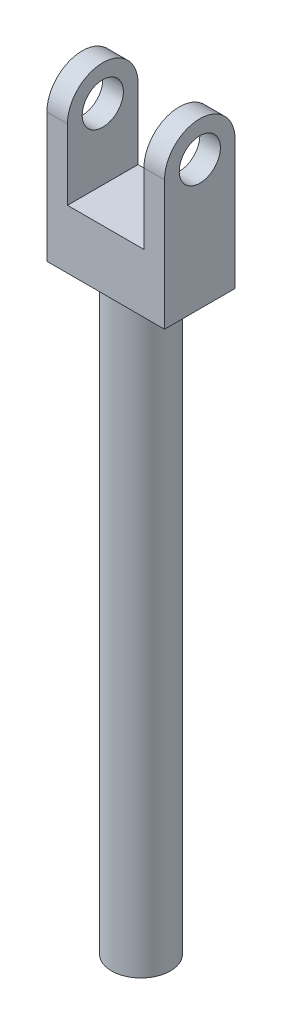
ISO-10303-21;
HEADER;
FILE_DESCRIPTION(('STEP AP214'),'2;1');
FILE_NAME('part.step','',(''),(''),'','','');
FILE_SCHEMA(('AUTOMOTIVE_DESIGN { 1 0 10303 214 1 1 1 1 }'));
ENDSEC;
DATA;
#1=APPLICATION_CONTEXT('core data for automotive mechanical design processes');
#2=APPLICATION_PROTOCOL_DEFINITION('international standard','automotive_design',2000,#1);
#3=PRODUCT_CONTEXT('',#1,'mechanical');
#4=PRODUCT('Part','Part','',(#3));
#5=PRODUCT_RELATED_PRODUCT_CATEGORY('part','',(#4));
#6=PRODUCT_DEFINITION_FORMATION('','',#4);
#7=PRODUCT_DEFINITION_CONTEXT('part definition',#1,'design');
#8=PRODUCT_DEFINITION('design','',#6,#7);
#9=PRODUCT_DEFINITION_SHAPE('','',#8);
#10=(LENGTH_UNIT() NAMED_UNIT(*) SI_UNIT(.MILLI.,.METRE.));
#11=(NAMED_UNIT(*) PLANE_ANGLE_UNIT() SI_UNIT($,.RADIAN.));
#12=(NAMED_UNIT(*) SI_UNIT($,.STERADIAN.) SOLID_ANGLE_UNIT());
#13=UNCERTAINTY_MEASURE_WITH_UNIT(LENGTH_MEASURE(1.E-05),#10,'distance_accuracy_value','');
#14=(GEOMETRIC_REPRESENTATION_CONTEXT(3) GLOBAL_UNCERTAINTY_ASSIGNED_CONTEXT((#13)) GLOBAL_UNIT_ASSIGNED_CONTEXT((#10,
#11,#12)) REPRESENTATION_CONTEXT('',''));
#15=CARTESIAN_POINT('',(0.,0.,0.));
#16=DIRECTION('',(0.,0.,1.));
#17=DIRECTION('',(1.,0.,0.));
#18=AXIS2_PLACEMENT_3D('',#15,#16,#17);
#19=CARTESIAN_POINT('',(10.,-22.,6.));
#20=DIRECTION('',(0.,1.,0.));
#21=DIRECTION('',(0.,0.,1.));
#22=AXIS2_PLACEMENT_3D('',#19,#20,#21);
#23=PLANE('',#22);
#24=DIRECTION('',(0.,0.,-1.));
#25=VECTOR('',#24,1.);
#26=CARTESIAN_POINT('',(-10.,-22.,6.));
#27=LINE('',#26,#25);
#28=CARTESIAN_POINT('',(-10.,-22.,6.));
#29=VERTEX_POINT('',#28);
#30=CARTESIAN_POINT('',(-10.,-22.,-6.));
#31=VERTEX_POINT('',#30);
#32=EDGE_CURVE('E158',#29,#31,#27,.T.);
#33=ORIENTED_EDGE('',*,*,#32,.T.);
#34=DIRECTION('',(-1.,0.,0.));
#35=VECTOR('',#34,1.);
#36=CARTESIAN_POINT('',(10.,-22.,-6.));
#37=LINE('',#36,#35);
#38=CARTESIAN_POINT('',(10.,-22.,-6.));
#39=VERTEX_POINT('',#38);
#40=EDGE_CURVE('E164',#39,#31,#37,.T.);
#41=ORIENTED_EDGE('',*,*,#40,.F.);
#42=DIRECTION('',(0.,0.,-1.));
#43=VECTOR('',#42,1.);
#44=CARTESIAN_POINT('',(10.,-22.,6.));
#45=LINE('',#44,#43);
#46=CARTESIAN_POINT('',(10.,-22.,6.));
#47=VERTEX_POINT('',#46);
#48=EDGE_CURVE('E152',#47,#39,#45,.T.);
#49=ORIENTED_EDGE('',*,*,#48,.F.);
#50=DIRECTION('',(-1.,0.,0.));
#51=VECTOR('',#50,1.);
#52=CARTESIAN_POINT('',(10.,-22.,6.));
#53=LINE('',#52,#51);
#54=EDGE_CURVE('E167',#47,#29,#53,.T.);
#55=ORIENTED_EDGE('',*,*,#54,.T.);
#56=EDGE_LOOP('',(#33,#41,#49,#55));
#57=FACE_BOUND('',#56,.T.);
#58=CARTESIAN_POINT('',(0.,-22.,0.));
#59=DIRECTION('',(0.,1.,0.));
#60=DIRECTION('',(0.,0.,1.));
#61=AXIS2_PLACEMENT_3D('',#58,#59,#60);
#62=CIRCLE('',#61,5.);
#63=CARTESIAN_POINT('',(0.,-22.,5.));
#64=VERTEX_POINT('',#63);
#65=EDGE_CURVE('E11',#64,#64,#62,.F.);
#66=ORIENTED_EDGE('',*,*,#65,.F.);
#67=EDGE_LOOP('',(#66));
#68=FACE_BOUND('',#67,.T.);
#69=ADVANCED_FACE('F33',(#57,#68),#23,.F.);
#70=CARTESIAN_POINT('',(10.,0.,0.));
#71=DIRECTION('',(-1.,0.,0.));
#72=DIRECTION('',(0.,0.,1.));
#73=AXIS2_PLACEMENT_3D('',#70,#71,#72);
#74=CYLINDRICAL_SURFACE('',#73,6.);
#75=CARTESIAN_POINT('',(-6.5,0.,0.));
#76=DIRECTION('',(-1.,0.,0.));
#77=DIRECTION('',(0.,-1.,0.));
#78=AXIS2_PLACEMENT_3D('',#75,#76,#77);
#79=CIRCLE('',#78,6.);
#80=CARTESIAN_POINT('',(-6.5,0.,6.));
#81=VERTEX_POINT('',#80);
#82=CARTESIAN_POINT('',(-6.5,0.,-6.));
#83=VERTEX_POINT('',#82);
#84=EDGE_CURVE('E139',#81,#83,#79,.T.);
#85=ORIENTED_EDGE('',*,*,#84,.T.);
#86=DIRECTION('',(-1.,0.,0.));
#87=VECTOR('',#86,1.);
#88=CARTESIAN_POINT('',(10.,0.,-6.));
#89=LINE('',#88,#87);
#90=CARTESIAN_POINT('',(-10.,0.,-6.));
#91=VERTEX_POINT('',#90);
#92=EDGE_CURVE('E79',#83,#91,#89,.T.);
#93=ORIENTED_EDGE('',*,*,#92,.T.);
#94=CARTESIAN_POINT('',(-10.,0.,0.));
#95=DIRECTION('',(1.,0.,0.));
#96=DIRECTION('',(0.,0.,-1.));
#97=AXIS2_PLACEMENT_3D('',#94,#95,#96);
#98=CIRCLE('',#97,6.);
#99=CARTESIAN_POINT('',(-10.,0.,6.));
#100=VERTEX_POINT('',#99);
#101=EDGE_CURVE('E145',#91,#100,#98,.T.);
#102=ORIENTED_EDGE('',*,*,#101,.T.);
#103=DIRECTION('',(-1.,0.,0.));
#104=VECTOR('',#103,1.);
#105=CARTESIAN_POINT('',(10.,0.,6.));
#106=LINE('',#105,#104);
#107=EDGE_CURVE('E170',#81,#100,#106,.T.);
#108=ORIENTED_EDGE('',*,*,#107,.F.);
#109=EDGE_LOOP('',(#85,#93,#102,#108));
#110=FACE_BOUND('',#109,.T.);
#111=ADVANCED_FACE('F193',(#110),#74,.T.);
#112=CARTESIAN_POINT('',(10.,0.,0.));
#113=DIRECTION('',(-1.,0.,0.));
#114=DIRECTION('',(0.,0.,1.));
#115=AXIS2_PLACEMENT_3D('',#112,#113,#114);
#116=CYLINDRICAL_SURFACE('',#115,3.5);
#117=CARTESIAN_POINT('',(-6.5,0.,0.));
#118=DIRECTION('',(-1.,0.,0.));
#119=DIRECTION('',(0.,-1.,0.));
#120=AXIS2_PLACEMENT_3D('',#117,#118,#119);
#121=CIRCLE('',#120,3.5);
#122=CARTESIAN_POINT('',(-6.5,-3.5,0.));
#123=VERTEX_POINT('',#122);
#124=EDGE_CURVE('E128',#123,#123,#121,.T.);
#125=ORIENTED_EDGE('',*,*,#124,.F.);
#126=EDGE_LOOP('',(#125));
#127=FACE_BOUND('',#126,.T.);
#128=CARTESIAN_POINT('',(-10.,0.,0.));
#129=DIRECTION('',(1.,0.,0.));
#130=DIRECTION('',(0.,0.,-1.));
#131=AXIS2_PLACEMENT_3D('',#128,#129,#130);
#132=CIRCLE('',#131,3.5);
#133=CARTESIAN_POINT('',(-10.,0.,-3.5));
#134=VERTEX_POINT('',#133);
#135=EDGE_CURVE('E113',#134,#134,#132,.T.);
#136=ORIENTED_EDGE('',*,*,#135,.F.);
#137=EDGE_LOOP('',(#136));
#138=FACE_BOUND('',#137,.T.);
#139=ADVANCED_FACE('F199',(#127,#138),#116,.F.);
#140=CARTESIAN_POINT('',(10.,0.,0.));
#141=DIRECTION('',(1.,0.,0.));
#142=DIRECTION('',(0.,0.,-1.));
#143=AXIS2_PLACEMENT_3D('',#140,#141,#142);
#144=PLANE('',#143);
#145=CARTESIAN_POINT('',(10.,0.,0.));
#146=DIRECTION('',(1.,0.,0.));
#147=DIRECTION('',(0.,0.,-1.));
#148=AXIS2_PLACEMENT_3D('',#145,#146,#147);
#149=CIRCLE('',#148,6.);
#150=CARTESIAN_POINT('',(10.,0.,-6.));
#151=VERTEX_POINT('',#150);
#152=CARTESIAN_POINT('',(10.,0.,6.));
#153=VERTEX_POINT('',#152);
#154=EDGE_CURVE('E148',#151,#153,#149,.T.);
#155=ORIENTED_EDGE('',*,*,#154,.T.);
#156=DIRECTION('',(0.,-1.,0.));
#157=VECTOR('',#156,1.);
#158=CARTESIAN_POINT('',(10.,0.,6.));
#159=LINE('',#158,#157);
#160=EDGE_CURVE('E87',#153,#47,#159,.T.);
#161=ORIENTED_EDGE('',*,*,#160,.T.);
#162=ORIENTED_EDGE('',*,*,#48,.T.);
#163=DIRECTION('',(0.,1.,0.));
#164=VECTOR('',#163,1.);
#165=CARTESIAN_POINT('',(10.,0.,-6.));
#166=LINE('',#165,#164);
#167=EDGE_CURVE('E57',#39,#151,#166,.T.);
#168=ORIENTED_EDGE('',*,*,#167,.T.);
#169=EDGE_LOOP('',(#155,#161,#162,#168));
#170=FACE_BOUND('',#169,.T.);
#171=CARTESIAN_POINT('',(10.,0.,0.));
#172=DIRECTION('',(1.,0.,0.));
#173=DIRECTION('',(0.,0.,-1.));
#174=AXIS2_PLACEMENT_3D('',#171,#172,#173);
#175=CIRCLE('',#174,3.5);
#176=CARTESIAN_POINT('',(10.,0.,-3.5));
#177=VERTEX_POINT('',#176);
#178=EDGE_CURVE('E142',#177,#177,#175,.T.);
#179=ORIENTED_EDGE('',*,*,#178,.F.);
#180=EDGE_LOOP('',(#179));
#181=FACE_BOUND('',#180,.T.);
#182=ADVANCED_FACE('F213',(#170,#181),#144,.T.);
#183=CARTESIAN_POINT('',(-10.,0.,0.));
#184=DIRECTION('',(1.,0.,0.));
#185=DIRECTION('',(0.,0.,-1.));
#186=AXIS2_PLACEMENT_3D('',#183,#184,#185);
#187=PLANE('',#186);
#188=ORIENTED_EDGE('',*,*,#101,.F.);
#189=DIRECTION('',(0.,1.,0.));
#190=VECTOR('',#189,1.);
#191=CARTESIAN_POINT('',(-10.,0.,-6.));
#192=LINE('',#191,#190);
#193=EDGE_CURVE('E150',#31,#91,#192,.T.);
#194=ORIENTED_EDGE('',*,*,#193,.F.);
#195=ORIENTED_EDGE('',*,*,#32,.F.);
#196=DIRECTION('',(0.,-1.,0.));
#197=VECTOR('',#196,1.);
#198=CARTESIAN_POINT('',(-10.,0.,6.));
#199=LINE('',#198,#197);
#200=EDGE_CURVE('E156',#100,#29,#199,.T.);
#201=ORIENTED_EDGE('',*,*,#200,.F.);
#202=EDGE_LOOP('',(#188,#194,#195,#201));
#203=FACE_BOUND('',#202,.T.);
#204=ORIENTED_EDGE('',*,*,#135,.T.);
#205=EDGE_LOOP('',(#204));
#206=FACE_BOUND('',#205,.T.);
#207=ADVANCED_FACE('F208',(#203,#206),#187,.F.);
#208=CARTESIAN_POINT('',(6.5,0.,-6.));
#209=VERTEX_POINT('',#208);
#210=EDGE_CURVE('E161',#151,#209,#89,.T.);
#211=ORIENTED_EDGE('',*,*,#210,.T.);
#212=CARTESIAN_POINT('',(6.5,0.,0.));
#213=DIRECTION('',(1.,0.,0.));
#214=DIRECTION('',(0.,1.,0.));
#215=AXIS2_PLACEMENT_3D('',#212,#213,#214);
#216=CIRCLE('',#215,6.);
#217=CARTESIAN_POINT('',(6.5,0.,6.));
#218=VERTEX_POINT('',#217);
#219=EDGE_CURVE('E129',#209,#218,#216,.T.);
#220=ORIENTED_EDGE('',*,*,#219,.T.);
#221=EDGE_CURVE('E127',#153,#218,#106,.T.);
#222=ORIENTED_EDGE('',*,*,#221,.F.);
#223=ORIENTED_EDGE('',*,*,#154,.F.);
#224=EDGE_LOOP('',(#211,#220,#222,#223));
#225=FACE_BOUND('',#224,.T.);
#226=ADVANCED_FACE('F35',(#225),#74,.T.);
#227=CARTESIAN_POINT('',(10.,0.,6.));
#228=DIRECTION('',(0.,0.,-1.));
#229=DIRECTION('',(0.,1.,0.));
#230=AXIS2_PLACEMENT_3D('',#227,#228,#229);
#231=PLANE('',#230);
#232=DIRECTION('',(-1.,0.,0.));
#233=VECTOR('',#232,1.);
#234=CARTESIAN_POINT('',(10.,-12.,6.));
#235=LINE('',#234,#233);
#236=CARTESIAN_POINT('',(6.5,-12.,6.));
#237=VERTEX_POINT('',#236);
#238=CARTESIAN_POINT('',(-6.5,-12.,6.));
#239=VERTEX_POINT('',#238);
#240=EDGE_CURVE('E107',#237,#239,#235,.T.);
#241=ORIENTED_EDGE('',*,*,#240,.T.);
#242=DIRECTION('',(0.,1.,0.));
#243=VECTOR('',#242,1.);
#244=CARTESIAN_POINT('',(-6.5,0.,6.));
#245=LINE('',#244,#243);
#246=EDGE_CURVE('E114',#239,#81,#245,.T.);
#247=ORIENTED_EDGE('',*,*,#246,.T.);
#248=ORIENTED_EDGE('',*,*,#107,.T.);
#249=ORIENTED_EDGE('',*,*,#200,.T.);
#250=ORIENTED_EDGE('',*,*,#54,.F.);
#251=ORIENTED_EDGE('',*,*,#160,.F.);
#252=ORIENTED_EDGE('',*,*,#221,.T.);
#253=DIRECTION('',(0.,-1.,0.));
#254=VECTOR('',#253,1.);
#255=CARTESIAN_POINT('',(6.5,0.,6.));
#256=LINE('',#255,#254);
#257=EDGE_CURVE('E118',#218,#237,#256,.T.);
#258=ORIENTED_EDGE('',*,*,#257,.T.);
#259=EDGE_LOOP('',(#241,#247,#248,#249,#250,#251,#252,#258));
#260=FACE_BOUND('',#259,.T.);
#261=ADVANCED_FACE('F125',(#260),#231,.F.);
#262=CARTESIAN_POINT('',(10.,0.,-6.));
#263=DIRECTION('',(0.,0.,1.));
#264=DIRECTION('',(0.,-1.,0.));
#265=AXIS2_PLACEMENT_3D('',#262,#263,#264);
#266=PLANE('',#265);
#267=ORIENTED_EDGE('',*,*,#92,.F.);
#268=DIRECTION('',(0.,-1.,0.));
#269=VECTOR('',#268,1.);
#270=CARTESIAN_POINT('',(-6.5,0.,-6.));
#271=LINE('',#270,#269);
#272=CARTESIAN_POINT('',(-6.5,-12.,-6.));
#273=VERTEX_POINT('',#272);
#274=EDGE_CURVE('E132',#83,#273,#271,.T.);
#275=ORIENTED_EDGE('',*,*,#274,.T.);
#276=DIRECTION('',(1.,0.,0.));
#277=VECTOR('',#276,1.);
#278=CARTESIAN_POINT('',(10.,-12.,-6.));
#279=LINE('',#278,#277);
#280=CARTESIAN_POINT('',(6.5,-12.,-6.));
#281=VERTEX_POINT('',#280);
#282=EDGE_CURVE('E41',#273,#281,#279,.T.);
#283=ORIENTED_EDGE('',*,*,#282,.T.);
#284=DIRECTION('',(0.,1.,0.));
#285=VECTOR('',#284,1.);
#286=CARTESIAN_POINT('',(6.5,0.,-6.));
#287=LINE('',#286,#285);
#288=EDGE_CURVE('E121',#281,#209,#287,.T.);
#289=ORIENTED_EDGE('',*,*,#288,.T.);
#290=ORIENTED_EDGE('',*,*,#210,.F.);
#291=ORIENTED_EDGE('',*,*,#167,.F.);
#292=ORIENTED_EDGE('',*,*,#40,.T.);
#293=ORIENTED_EDGE('',*,*,#193,.T.);
#294=EDGE_LOOP('',(#267,#275,#283,#289,#290,#291,#292,#293));
#295=FACE_BOUND('',#294,.T.);
#296=ADVANCED_FACE('F174',(#295),#266,.F.);
#297=CARTESIAN_POINT('',(6.5,0.,0.));
#298=DIRECTION('',(1.,0.,0.));
#299=DIRECTION('',(0.,1.,0.));
#300=AXIS2_PLACEMENT_3D('',#297,#298,#299);
#301=CIRCLE('',#300,3.5);
#302=CARTESIAN_POINT('',(6.5,3.5,0.));
#303=VERTEX_POINT('',#302);
#304=EDGE_CURVE('E123',#303,#303,#301,.T.);
#305=ORIENTED_EDGE('',*,*,#304,.F.);
#306=EDGE_LOOP('',(#305));
#307=FACE_BOUND('',#306,.T.);
#308=ORIENTED_EDGE('',*,*,#178,.T.);
#309=EDGE_LOOP('',(#308));
#310=FACE_BOUND('',#309,.T.);
#311=ADVANCED_FACE('F207',(#307,#310),#116,.F.);
#312=CARTESIAN_POINT('',(-6.5,-12.,-10.));
#313=DIRECTION('',(0.,-1.,0.));
#314=DIRECTION('',(0.,0.,-1.));
#315=AXIS2_PLACEMENT_3D('',#312,#313,#314);
#316=PLANE('',#315);
#317=DIRECTION('',(0.,0.,1.));
#318=VECTOR('',#317,1.);
#319=CARTESIAN_POINT('',(6.5,-12.,-10.));
#320=LINE('',#319,#318);
#321=EDGE_CURVE('E48',#281,#237,#320,.T.);
#322=ORIENTED_EDGE('',*,*,#321,.F.);
#323=ORIENTED_EDGE('',*,*,#282,.F.);
#324=DIRECTION('',(0.,0.,1.));
#325=VECTOR('',#324,1.);
#326=CARTESIAN_POINT('',(-6.5,-12.,-10.));
#327=LINE('',#326,#325);
#328=EDGE_CURVE('E110',#273,#239,#327,.T.);
#329=ORIENTED_EDGE('',*,*,#328,.T.);
#330=ORIENTED_EDGE('',*,*,#240,.F.);
#331=EDGE_LOOP('',(#322,#323,#329,#330));
#332=FACE_BOUND('',#331,.T.);
#333=ADVANCED_FACE('F108',(#332),#316,.F.);
#334=CARTESIAN_POINT('',(-6.5,6.00000000000001,-10.));
#335=DIRECTION('',(-1.,0.,0.));
#336=DIRECTION('',(0.,-1.,0.));
#337=AXIS2_PLACEMENT_3D('',#334,#335,#336);
#338=PLANE('',#337);
#339=ORIENTED_EDGE('',*,*,#124,.T.);
#340=EDGE_LOOP('',(#339));
#341=FACE_BOUND('',#340,.T.);
#342=ORIENTED_EDGE('',*,*,#328,.F.);
#343=ORIENTED_EDGE('',*,*,#274,.F.);
#344=ORIENTED_EDGE('',*,*,#84,.F.);
#345=ORIENTED_EDGE('',*,*,#246,.F.);
#346=EDGE_LOOP('',(#342,#343,#344,#345));
#347=FACE_BOUND('',#346,.T.);
#348=ADVANCED_FACE('F177',(#341,#347),#338,.F.);
#349=CARTESIAN_POINT('',(6.5,6.00000000000001,-10.));
#350=DIRECTION('',(1.,0.,0.));
#351=DIRECTION('',(0.,1.,0.));
#352=AXIS2_PLACEMENT_3D('',#349,#350,#351);
#353=PLANE('',#352);
#354=ORIENTED_EDGE('',*,*,#304,.T.);
#355=EDGE_LOOP('',(#354));
#356=FACE_BOUND('',#355,.T.);
#357=ORIENTED_EDGE('',*,*,#219,.F.);
#358=ORIENTED_EDGE('',*,*,#288,.F.);
#359=ORIENTED_EDGE('',*,*,#321,.T.);
#360=ORIENTED_EDGE('',*,*,#257,.F.);
#361=EDGE_LOOP('',(#357,#358,#359,#360));
#362=FACE_BOUND('',#361,.T.);
#363=ADVANCED_FACE('F117',(#356,#362),#353,.F.);
#364=CARTESIAN_POINT('',(0.,-122.,0.));
#365=DIRECTION('',(0.,1.,0.));
#366=DIRECTION('',(0.,0.,1.));
#367=AXIS2_PLACEMENT_3D('',#364,#365,#366);
#368=CYLINDRICAL_SURFACE('',#367,5.);
#369=CARTESIAN_POINT('',(0.,-122.,0.));
#370=DIRECTION('',(0.,-1.,0.));
#371=DIRECTION('',(0.,0.,-1.));
#372=AXIS2_PLACEMENT_3D('',#369,#370,#371);
#373=CIRCLE('',#372,5.);
#374=CARTESIAN_POINT('',(0.,-122.,-5.));
#375=VERTEX_POINT('',#374);
#376=EDGE_CURVE('E178',#375,#375,#373,.T.);
#377=ORIENTED_EDGE('',*,*,#376,.F.);
#378=EDGE_LOOP('',(#377));
#379=FACE_BOUND('',#378,.T.);
#380=ORIENTED_EDGE('',*,*,#65,.T.);
#381=EDGE_LOOP('',(#380));
#382=FACE_BOUND('',#381,.T.);
#383=ADVANCED_FACE('F186',(#379,#382),#368,.T.);
#384=CARTESIAN_POINT('',(0.,-122.,0.));
#385=DIRECTION('',(0.,-1.,0.));
#386=DIRECTION('',(0.,0.,-1.));
#387=AXIS2_PLACEMENT_3D('',#384,#385,#386);
#388=PLANE('',#387);
#389=ORIENTED_EDGE('',*,*,#376,.T.);
#390=EDGE_LOOP('',(#389));
#391=FACE_BOUND('',#390,.T.);
#392=ADVANCED_FACE('F184',(#391),#388,.T.);
#393=CLOSED_SHELL('',(#69,#111,#139,#182,#207,#226,#261,#296,#311,#333,#348,#363,#383,#392));
#394=MANIFOLD_SOLID_BREP('B2',#393);
#395=ADVANCED_BREP_SHAPE_REPRESENTATION('',(#18,#394),#14);
#396=SHAPE_DEFINITION_REPRESENTATION(#9,#395);
ENDSEC;
END-ISO-10303-21;
